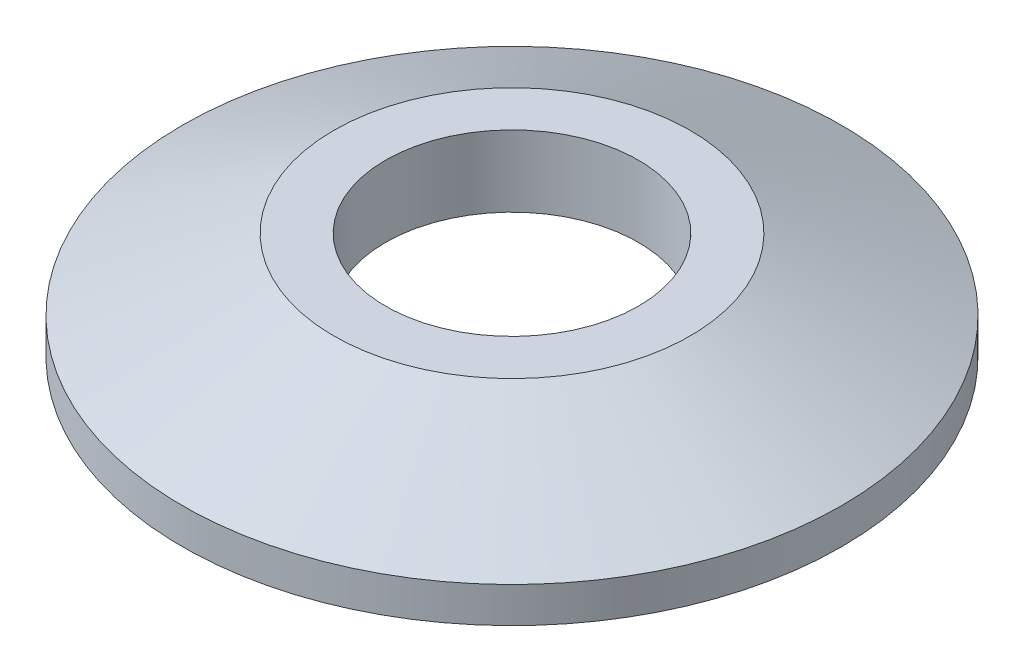
ISO-10303-21;
HEADER;
FILE_DESCRIPTION(('STEP AP214'),'2;1');
FILE_NAME('part.step','',(''),(''),'','','');
FILE_SCHEMA(('AUTOMOTIVE_DESIGN { 1 0 10303 214 1 1 1 1 }'));
ENDSEC;
DATA;
#1=APPLICATION_CONTEXT('core data for automotive mechanical design processes');
#2=APPLICATION_PROTOCOL_DEFINITION('international standard','automotive_design',2000,#1);
#3=PRODUCT_CONTEXT('',#1,'mechanical');
#4=PRODUCT('Part','Part','',(#3));
#5=PRODUCT_RELATED_PRODUCT_CATEGORY('part','',(#4));
#6=PRODUCT_DEFINITION_FORMATION('','',#4);
#7=PRODUCT_DEFINITION_CONTEXT('part definition',#1,'design');
#8=PRODUCT_DEFINITION('design','',#6,#7);
#9=PRODUCT_DEFINITION_SHAPE('','',#8);
#10=(LENGTH_UNIT() NAMED_UNIT(*) SI_UNIT(.MILLI.,.METRE.));
#11=(NAMED_UNIT(*) PLANE_ANGLE_UNIT() SI_UNIT($,.RADIAN.));
#12=(NAMED_UNIT(*) SI_UNIT($,.STERADIAN.) SOLID_ANGLE_UNIT());
#13=UNCERTAINTY_MEASURE_WITH_UNIT(LENGTH_MEASURE(1.E-05),#10,'distance_accuracy_value','');
#14=(GEOMETRIC_REPRESENTATION_CONTEXT(3) GLOBAL_UNCERTAINTY_ASSIGNED_CONTEXT((#13)) GLOBAL_UNIT_ASSIGNED_CONTEXT((#10,
#11,#12)) REPRESENTATION_CONTEXT('',''));
#15=CARTESIAN_POINT('',(0.,0.,0.));
#16=DIRECTION('',(0.,0.,1.));
#17=DIRECTION('',(1.,0.,0.));
#18=AXIS2_PLACEMENT_3D('',#15,#16,#17);
#19=CARTESIAN_POINT('',(-10.,0.,0.));
#20=DIRECTION('',(0.,-1.,0.));
#21=DIRECTION('',(1.,0.,0.));
#22=AXIS2_PLACEMENT_3D('',#19,#20,#21);
#23=PLANE('',#22);
#24=CARTESIAN_POINT('',(0.,0.,0.));
#25=DIRECTION('',(0.,1.,0.));
#26=DIRECTION('',(-1.,0.,0.));
#27=AXIS2_PLACEMENT_3D('',#24,#25,#26);
#28=CIRCLE('',#27,10.);
#29=CARTESIAN_POINT('',(-10.,0.,0.));
#30=VERTEX_POINT('',#29);
#31=EDGE_CURVE('E55',#30,#30,#28,.T.);
#32=ORIENTED_EDGE('',*,*,#31,.T.);
#33=EDGE_LOOP('',(#32));
#34=FACE_BOUND('',#33,.T.);
#35=CARTESIAN_POINT('',(0.,0.,0.));
#36=DIRECTION('',(0.,1.,0.));
#37=DIRECTION('',(-1.,0.,0.));
#38=AXIS2_PLACEMENT_3D('',#35,#36,#37);
#39=CIRCLE('',#38,18.5);
#40=CARTESIAN_POINT('',(-18.5,0.,0.));
#41=VERTEX_POINT('',#40);
#42=EDGE_CURVE('E10',#41,#41,#39,.T.);
#43=ORIENTED_EDGE('',*,*,#42,.F.);
#44=EDGE_LOOP('',(#43));
#45=FACE_BOUND('',#44,.T.);
#46=ADVANCED_FACE('F30',(#34,#45),#23,.T.);
#47=CARTESIAN_POINT('',(0.,22.2675624043961,0.));
#48=DIRECTION('',(0.,1.,0.));
#49=DIRECTION('',(-1.,0.,0.));
#50=AXIS2_PLACEMENT_3D('',#47,#48,#49);
#51=CYLINDRICAL_SURFACE('',#50,18.5);
#52=ORIENTED_EDGE('',*,*,#42,.T.);
#53=EDGE_LOOP('',(#52));
#54=FACE_BOUND('',#53,.T.);
#55=CARTESIAN_POINT('',(0.,2.,0.));
#56=DIRECTION('',(0.,1.,0.));
#57=DIRECTION('',(-1.,0.,0.));
#58=AXIS2_PLACEMENT_3D('',#55,#56,#57);
#59=CIRCLE('',#58,18.5);
#60=CARTESIAN_POINT('',(-18.5,2.,0.));
#61=VERTEX_POINT('',#60);
#62=EDGE_CURVE('E36',#61,#61,#59,.T.);
#63=ORIENTED_EDGE('',*,*,#62,.F.);
#64=EDGE_LOOP('',(#63));
#65=FACE_BOUND('',#64,.T.);
#66=ADVANCED_FACE('F73',(#54,#65),#51,.T.);
#67=CARTESIAN_POINT('',(0.,6.,0.));
#68=DIRECTION('',(0.,-1.,0.));
#69=DIRECTION('',(1.,0.,0.));
#70=AXIS2_PLACEMENT_3D('',#67,#68,#69);
#71=CONICAL_SURFACE('',#70,10.,1.13095374397916);
#72=ORIENTED_EDGE('',*,*,#62,.T.);
#73=EDGE_LOOP('',(#72));
#74=FACE_BOUND('',#73,.T.);
#75=CARTESIAN_POINT('',(0.,6.,0.));
#76=DIRECTION('',(0.,1.,0.));
#77=DIRECTION('',(-1.,0.,0.));
#78=AXIS2_PLACEMENT_3D('',#75,#76,#77);
#79=CIRCLE('',#78,10.);
#80=CARTESIAN_POINT('',(-10.,6.,0.));
#81=VERTEX_POINT('',#80);
#82=EDGE_CURVE('E40',#81,#81,#79,.T.);
#83=ORIENTED_EDGE('',*,*,#82,.F.);
#84=EDGE_LOOP('',(#83));
#85=FACE_BOUND('',#84,.T.);
#86=ADVANCED_FACE('F77',(#74,#85),#71,.T.);
#87=CARTESIAN_POINT('',(-10.,6.,0.));
#88=DIRECTION('',(0.,1.,0.));
#89=DIRECTION('',(-1.,0.,0.));
#90=AXIS2_PLACEMENT_3D('',#87,#88,#89);
#91=PLANE('',#90);
#92=ORIENTED_EDGE('',*,*,#82,.T.);
#93=EDGE_LOOP('',(#92));
#94=FACE_BOUND('',#93,.T.);
#95=CARTESIAN_POINT('',(0.,6.,0.));
#96=DIRECTION('',(0.,1.,0.));
#97=DIRECTION('',(-1.,0.,0.));
#98=AXIS2_PLACEMENT_3D('',#95,#96,#97);
#99=CIRCLE('',#98,7.1);
#100=CARTESIAN_POINT('',(-7.1,6.,0.));
#101=VERTEX_POINT('',#100);
#102=EDGE_CURVE('E44',#101,#101,#99,.T.);
#103=ORIENTED_EDGE('',*,*,#102,.F.);
#104=EDGE_LOOP('',(#103));
#105=FACE_BOUND('',#104,.T.);
#106=ADVANCED_FACE('F81',(#94,#105),#91,.T.);
#107=CARTESIAN_POINT('',(0.,22.2675624043961,0.));
#108=DIRECTION('',(0.,1.,0.));
#109=DIRECTION('',(-1.,0.,0.));
#110=AXIS2_PLACEMENT_3D('',#107,#108,#109);
#111=CYLINDRICAL_SURFACE('',#110,7.1);
#112=ORIENTED_EDGE('',*,*,#102,.T.);
#113=EDGE_LOOP('',(#112));
#114=FACE_BOUND('',#113,.T.);
#115=CARTESIAN_POINT('',(0.,2.,0.));
#116=DIRECTION('',(0.,1.,0.));
#117=DIRECTION('',(-1.,0.,0.));
#118=AXIS2_PLACEMENT_3D('',#115,#116,#117);
#119=CIRCLE('',#118,7.1);
#120=CARTESIAN_POINT('',(-7.1,2.,0.));
#121=VERTEX_POINT('',#120);
#122=EDGE_CURVE('E49',#121,#121,#119,.T.);
#123=ORIENTED_EDGE('',*,*,#122,.F.);
#124=EDGE_LOOP('',(#123));
#125=FACE_BOUND('',#124,.T.);
#126=ADVANCED_FACE('F69',(#114,#125),#111,.F.);
#127=CARTESIAN_POINT('',(-7.1,2.,0.));
#128=DIRECTION('',(0.,-1.,0.));
#129=DIRECTION('',(1.,0.,0.));
#130=AXIS2_PLACEMENT_3D('',#127,#128,#129);
#131=PLANE('',#130);
#132=ORIENTED_EDGE('',*,*,#122,.T.);
#133=EDGE_LOOP('',(#132));
#134=FACE_BOUND('',#133,.T.);
#135=CARTESIAN_POINT('',(0.,2.00000000000001,0.));
#136=DIRECTION('',(0.,1.,0.));
#137=DIRECTION('',(-1.,0.,0.));
#138=AXIS2_PLACEMENT_3D('',#135,#136,#137);
#139=CIRCLE('',#138,10.);
#140=CARTESIAN_POINT('',(-10.,2.,0.));
#141=VERTEX_POINT('',#140);
#142=EDGE_CURVE('E52',#141,#141,#139,.T.);
#143=ORIENTED_EDGE('',*,*,#142,.F.);
#144=EDGE_LOOP('',(#143));
#145=FACE_BOUND('',#144,.T.);
#146=ADVANCED_FACE('F63',(#134,#145),#131,.T.);
#147=CARTESIAN_POINT('',(0.,22.2675624043961,0.));
#148=DIRECTION('',(0.,1.,0.));
#149=DIRECTION('',(-1.,0.,0.));
#150=AXIS2_PLACEMENT_3D('',#147,#148,#149);
#151=CYLINDRICAL_SURFACE('',#150,10.);
#152=ORIENTED_EDGE('',*,*,#142,.T.);
#153=EDGE_LOOP('',(#152));
#154=FACE_BOUND('',#153,.T.);
#155=ORIENTED_EDGE('',*,*,#31,.F.);
#156=EDGE_LOOP('',(#155));
#157=FACE_BOUND('',#156,.T.);
#158=ADVANCED_FACE('F61',(#154,#157),#151,.F.);
#159=CLOSED_SHELL('',(#46,#66,#86,#106,#126,#146,#158));
#160=MANIFOLD_SOLID_BREP('B2',#159);
#161=ADVANCED_BREP_SHAPE_REPRESENTATION('',(#18,#160),#14);
#162=SHAPE_DEFINITION_REPRESENTATION(#9,#161);
ENDSEC;
END-ISO-10303-21;
